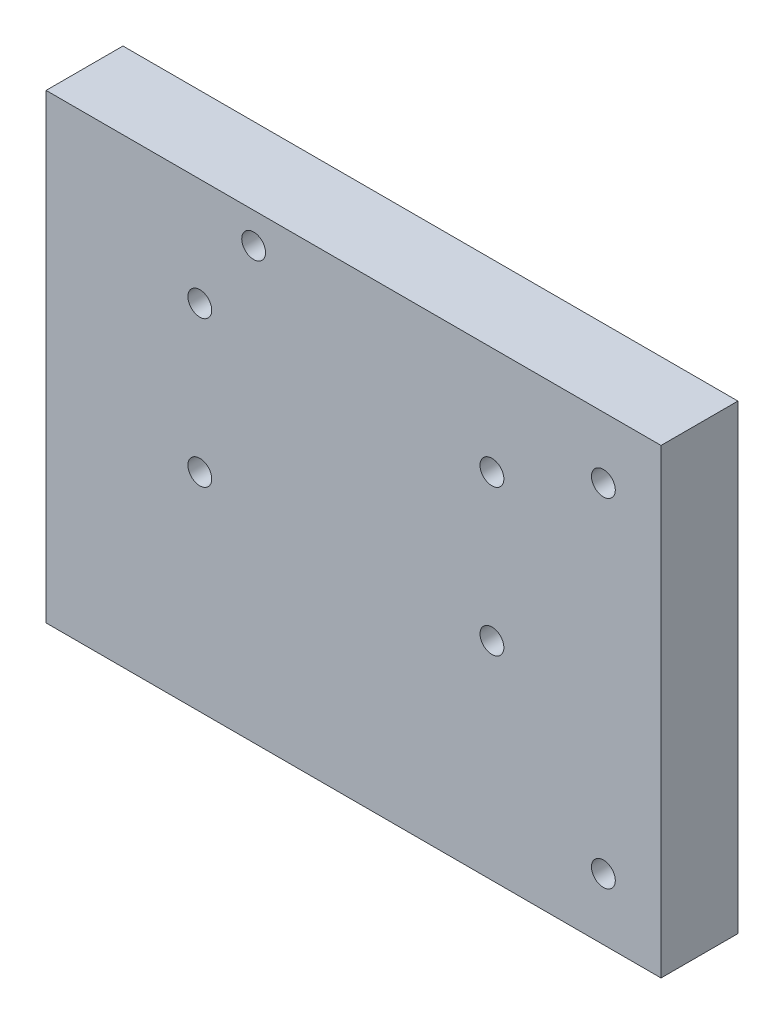
ISO-10303-21;
HEADER;
FILE_DESCRIPTION(('STEP AP214'),'2;1');
FILE_NAME('part.step','',(''),(''),'','','');
FILE_SCHEMA(('AUTOMOTIVE_DESIGN { 1 0 10303 214 1 1 1 1 }'));
ENDSEC;
DATA;
#1=APPLICATION_CONTEXT('core data for automotive mechanical design processes');
#2=APPLICATION_PROTOCOL_DEFINITION('international standard','automotive_design',2000,#1);
#3=PRODUCT_CONTEXT('',#1,'mechanical');
#4=PRODUCT('Part','Part','',(#3));
#5=PRODUCT_RELATED_PRODUCT_CATEGORY('part','',(#4));
#6=PRODUCT_DEFINITION_FORMATION('','',#4);
#7=PRODUCT_DEFINITION_CONTEXT('part definition',#1,'design');
#8=PRODUCT_DEFINITION('design','',#6,#7);
#9=PRODUCT_DEFINITION_SHAPE('','',#8);
#10=(LENGTH_UNIT() NAMED_UNIT(*) SI_UNIT(.MILLI.,.METRE.));
#11=(NAMED_UNIT(*) PLANE_ANGLE_UNIT() SI_UNIT($,.RADIAN.));
#12=(NAMED_UNIT(*) SI_UNIT($,.STERADIAN.) SOLID_ANGLE_UNIT());
#13=UNCERTAINTY_MEASURE_WITH_UNIT(LENGTH_MEASURE(1.E-05),#10,'distance_accuracy_value','');
#14=(GEOMETRIC_REPRESENTATION_CONTEXT(3) GLOBAL_UNCERTAINTY_ASSIGNED_CONTEXT((#13)) GLOBAL_UNIT_ASSIGNED_CONTEXT((#10,
#11,#12)) REPRESENTATION_CONTEXT('',''));
#15=CARTESIAN_POINT('',(0.,0.,0.));
#16=DIRECTION('',(0.,0.,1.));
#17=DIRECTION('',(1.,0.,0.));
#18=AXIS2_PLACEMENT_3D('',#15,#16,#17);
#19=CARTESIAN_POINT('',(0.,0.,10.));
#20=DIRECTION('',(0.,0.,-1.));
#21=DIRECTION('',(-1.,0.,0.));
#22=AXIS2_PLACEMENT_3D('',#19,#20,#21);
#23=PLANE('',#22);
#24=CARTESIAN_POINT('',(32.5,22.,10.));
#25=DIRECTION('',(0.,0.,1.));
#26=DIRECTION('',(1.,0.,0.));
#27=AXIS2_PLACEMENT_3D('',#24,#25,#26);
#28=CIRCLE('',#27,1.55);
#29=CARTESIAN_POINT('',(34.05,22.,10.));
#30=VERTEX_POINT('',#29);
#31=EDGE_CURVE('E145',#30,#30,#28,.T.);
#32=ORIENTED_EDGE('',*,*,#31,.F.);
#33=EDGE_LOOP('',(#32));
#34=FACE_BOUND('',#33,.T.);
#35=CARTESIAN_POINT('',(32.5,-22.,10.));
#36=DIRECTION('',(0.,0.,1.));
#37=DIRECTION('',(1.,0.,0.));
#38=AXIS2_PLACEMENT_3D('',#35,#36,#37);
#39=CIRCLE('',#38,1.54999999999999);
#40=CARTESIAN_POINT('',(34.05,-22.,10.));
#41=VERTEX_POINT('',#40);
#42=EDGE_CURVE('E149',#41,#41,#39,.T.);
#43=ORIENTED_EDGE('',*,*,#42,.F.);
#44=EDGE_LOOP('',(#43));
#45=FACE_BOUND('',#44,.T.);
#46=CARTESIAN_POINT('',(-13.,26.,10.));
#47=DIRECTION('',(0.,0.,-1.));
#48=DIRECTION('',(-1.,0.,0.));
#49=AXIS2_PLACEMENT_3D('',#46,#47,#48);
#50=CIRCLE('',#49,1.55);
#51=CARTESIAN_POINT('',(-14.55,26.,10.));
#52=VERTEX_POINT('',#51);
#53=EDGE_CURVE('E137',#52,#52,#50,.F.);
#54=ORIENTED_EDGE('',*,*,#53,.F.);
#55=EDGE_LOOP('',(#54));
#56=FACE_BOUND('',#55,.T.);
#57=DIRECTION('',(0.,1.,0.));
#58=VECTOR('',#57,1.);
#59=CARTESIAN_POINT('',(40.,-30.,10.));
#60=LINE('',#59,#58);
#61=CARTESIAN_POINT('',(40.,-30.,10.));
#62=VERTEX_POINT('',#61);
#63=CARTESIAN_POINT('',(40.,30.,10.));
#64=VERTEX_POINT('',#63);
#65=EDGE_CURVE('E89',#62,#64,#60,.T.);
#66=ORIENTED_EDGE('',*,*,#65,.T.);
#67=DIRECTION('',(-1.,0.,0.));
#68=VECTOR('',#67,1.);
#69=CARTESIAN_POINT('',(-40.,30.,10.));
#70=LINE('',#69,#68);
#71=CARTESIAN_POINT('',(-40.,30.,10.));
#72=VERTEX_POINT('',#71);
#73=EDGE_CURVE('E84',#64,#72,#70,.T.);
#74=ORIENTED_EDGE('',*,*,#73,.T.);
#75=DIRECTION('',(0.,-1.,0.));
#76=VECTOR('',#75,1.);
#77=CARTESIAN_POINT('',(-40.,-30.,10.));
#78=LINE('',#77,#76);
#79=CARTESIAN_POINT('',(-40.,-30.,10.));
#80=VERTEX_POINT('',#79);
#81=EDGE_CURVE('E87',#72,#80,#78,.T.);
#82=ORIENTED_EDGE('',*,*,#81,.T.);
#83=DIRECTION('',(1.,0.,0.));
#84=VECTOR('',#83,1.);
#85=CARTESIAN_POINT('',(-40.,-30.,10.));
#86=LINE('',#85,#84);
#87=EDGE_CURVE('E54',#80,#62,#86,.T.);
#88=ORIENTED_EDGE('',*,*,#87,.T.);
#89=EDGE_LOOP('',(#66,#74,#82,#88));
#90=FACE_BOUND('',#89,.T.);
#91=CARTESIAN_POINT('',(-20.,16.,10.));
#92=DIRECTION('',(0.,0.,1.));
#93=DIRECTION('',(1.,0.,0.));
#94=AXIS2_PLACEMENT_3D('',#91,#92,#93);
#95=CIRCLE('',#94,1.55);
#96=CARTESIAN_POINT('',(-18.45,16.,10.));
#97=VERTEX_POINT('',#96);
#98=EDGE_CURVE('E104',#97,#97,#95,.T.);
#99=ORIENTED_EDGE('',*,*,#98,.F.);
#100=EDGE_LOOP('',(#99));
#101=FACE_BOUND('',#100,.T.);
#102=CARTESIAN_POINT('',(18.,16.,10.));
#103=DIRECTION('',(0.,0.,1.));
#104=DIRECTION('',(1.,0.,0.));
#105=AXIS2_PLACEMENT_3D('',#102,#103,#104);
#106=CIRCLE('',#105,1.55);
#107=CARTESIAN_POINT('',(19.55,16.,10.));
#108=VERTEX_POINT('',#107);
#109=EDGE_CURVE('E119',#108,#108,#106,.T.);
#110=ORIENTED_EDGE('',*,*,#109,.F.);
#111=EDGE_LOOP('',(#110));
#112=FACE_BOUND('',#111,.T.);
#113=CARTESIAN_POINT('',(18.,-3.,10.));
#114=DIRECTION('',(0.,0.,1.));
#115=DIRECTION('',(1.,0.,0.));
#116=AXIS2_PLACEMENT_3D('',#113,#114,#115);
#117=CIRCLE('',#116,1.55);
#118=CARTESIAN_POINT('',(19.55,-3.,10.));
#119=VERTEX_POINT('',#118);
#120=EDGE_CURVE('E125',#119,#119,#117,.T.);
#121=ORIENTED_EDGE('',*,*,#120,.F.);
#122=EDGE_LOOP('',(#121));
#123=FACE_BOUND('',#122,.T.);
#124=CARTESIAN_POINT('',(-20.,-3.,10.));
#125=DIRECTION('',(0.,0.,1.));
#126=DIRECTION('',(1.,0.,0.));
#127=AXIS2_PLACEMENT_3D('',#124,#125,#126);
#128=CIRCLE('',#127,1.55);
#129=CARTESIAN_POINT('',(-18.45,-3.,10.));
#130=VERTEX_POINT('',#129);
#131=EDGE_CURVE('E131',#130,#130,#128,.T.);
#132=ORIENTED_EDGE('',*,*,#131,.F.);
#133=EDGE_LOOP('',(#132));
#134=FACE_BOUND('',#133,.T.);
#135=ADVANCED_FACE('F37',(#34,#45,#56,#90,#101,#112,#123,#134),#23,.F.);
#136=CARTESIAN_POINT('',(0.,0.,0.));
#137=DIRECTION('',(0.,0.,-1.));
#138=DIRECTION('',(-1.,0.,0.));
#139=AXIS2_PLACEMENT_3D('',#136,#137,#138);
#140=PLANE('',#139);
#141=CARTESIAN_POINT('',(32.5,22.,0.));
#142=DIRECTION('',(0.,0.,-1.));
#143=DIRECTION('',(-1.,0.,0.));
#144=AXIS2_PLACEMENT_3D('',#141,#142,#143);
#145=CIRCLE('',#144,1.55);
#146=CARTESIAN_POINT('',(30.95,22.,0.));
#147=VERTEX_POINT('',#146);
#148=EDGE_CURVE('E152',#147,#147,#145,.F.);
#149=ORIENTED_EDGE('',*,*,#148,.T.);
#150=EDGE_LOOP('',(#149));
#151=FACE_BOUND('',#150,.T.);
#152=CARTESIAN_POINT('',(32.5,-22.,0.));
#153=DIRECTION('',(0.,0.,-1.));
#154=DIRECTION('',(-1.,0.,0.));
#155=AXIS2_PLACEMENT_3D('',#152,#153,#154);
#156=CIRCLE('',#155,1.54999999999999);
#157=CARTESIAN_POINT('',(30.95,-22.,0.));
#158=VERTEX_POINT('',#157);
#159=EDGE_CURVE('E146',#158,#158,#156,.F.);
#160=ORIENTED_EDGE('',*,*,#159,.T.);
#161=EDGE_LOOP('',(#160));
#162=FACE_BOUND('',#161,.T.);
#163=CARTESIAN_POINT('',(-13.,26.,0.));
#164=DIRECTION('',(0.,0.,-1.));
#165=DIRECTION('',(-1.,0.,0.));
#166=AXIS2_PLACEMENT_3D('',#163,#164,#165);
#167=CIRCLE('',#166,1.55);
#168=CARTESIAN_POINT('',(-14.55,26.,0.));
#169=VERTEX_POINT('',#168);
#170=EDGE_CURVE('E142',#169,#169,#167,.T.);
#171=ORIENTED_EDGE('',*,*,#170,.F.);
#172=EDGE_LOOP('',(#171));
#173=FACE_BOUND('',#172,.T.);
#174=CARTESIAN_POINT('',(18.,-3.,0.));
#175=DIRECTION('',(0.,0.,1.));
#176=DIRECTION('',(1.,0.,0.));
#177=AXIS2_PLACEMENT_3D('',#174,#175,#176);
#178=CIRCLE('',#177,1.55);
#179=CARTESIAN_POINT('',(19.55,-3.,0.));
#180=VERTEX_POINT('',#179);
#181=EDGE_CURVE('E128',#180,#180,#178,.T.);
#182=ORIENTED_EDGE('',*,*,#181,.T.);
#183=EDGE_LOOP('',(#182));
#184=FACE_BOUND('',#183,.T.);
#185=CARTESIAN_POINT('',(-20.,16.,0.));
#186=DIRECTION('',(0.,0.,1.));
#187=DIRECTION('',(1.,0.,0.));
#188=AXIS2_PLACEMENT_3D('',#185,#186,#187);
#189=CIRCLE('',#188,1.55);
#190=CARTESIAN_POINT('',(-18.45,16.,0.));
#191=VERTEX_POINT('',#190);
#192=EDGE_CURVE('E116',#191,#191,#189,.T.);
#193=ORIENTED_EDGE('',*,*,#192,.T.);
#194=EDGE_LOOP('',(#193));
#195=FACE_BOUND('',#194,.T.);
#196=DIRECTION('',(0.,1.,0.));
#197=VECTOR('',#196,1.);
#198=CARTESIAN_POINT('',(40.,-30.,0.));
#199=LINE('',#198,#197);
#200=CARTESIAN_POINT('',(40.,-30.,0.));
#201=VERTEX_POINT('',#200);
#202=CARTESIAN_POINT('',(40.,30.,0.));
#203=VERTEX_POINT('',#202);
#204=EDGE_CURVE('E101',#201,#203,#199,.T.);
#205=ORIENTED_EDGE('',*,*,#204,.F.);
#206=DIRECTION('',(1.,0.,0.));
#207=VECTOR('',#206,1.);
#208=CARTESIAN_POINT('',(-40.,-30.,0.));
#209=LINE('',#208,#207);
#210=CARTESIAN_POINT('',(-40.,-30.,0.));
#211=VERTEX_POINT('',#210);
#212=EDGE_CURVE('E77',#211,#201,#209,.T.);
#213=ORIENTED_EDGE('',*,*,#212,.F.);
#214=DIRECTION('',(0.,-1.,0.));
#215=VECTOR('',#214,1.);
#216=CARTESIAN_POINT('',(-40.,-30.,0.));
#217=LINE('',#216,#215);
#218=CARTESIAN_POINT('',(-40.,30.,0.));
#219=VERTEX_POINT('',#218);
#220=EDGE_CURVE('E71',#219,#211,#217,.T.);
#221=ORIENTED_EDGE('',*,*,#220,.F.);
#222=DIRECTION('',(-1.,0.,0.));
#223=VECTOR('',#222,1.);
#224=CARTESIAN_POINT('',(-40.,30.,0.));
#225=LINE('',#224,#223);
#226=EDGE_CURVE('E93',#203,#219,#225,.T.);
#227=ORIENTED_EDGE('',*,*,#226,.F.);
#228=EDGE_LOOP('',(#205,#213,#221,#227));
#229=FACE_BOUND('',#228,.T.);
#230=CARTESIAN_POINT('',(18.,16.,0.));
#231=DIRECTION('',(0.,0.,1.));
#232=DIRECTION('',(1.,0.,0.));
#233=AXIS2_PLACEMENT_3D('',#230,#231,#232);
#234=CIRCLE('',#233,1.55);
#235=CARTESIAN_POINT('',(19.55,16.,0.));
#236=VERTEX_POINT('',#235);
#237=EDGE_CURVE('E122',#236,#236,#234,.T.);
#238=ORIENTED_EDGE('',*,*,#237,.T.);
#239=EDGE_LOOP('',(#238));
#240=FACE_BOUND('',#239,.T.);
#241=CARTESIAN_POINT('',(-20.,-3.,0.));
#242=DIRECTION('',(0.,0.,1.));
#243=DIRECTION('',(1.,0.,0.));
#244=AXIS2_PLACEMENT_3D('',#241,#242,#243);
#245=CIRCLE('',#244,1.55);
#246=CARTESIAN_POINT('',(-18.45,-3.,0.));
#247=VERTEX_POINT('',#246);
#248=EDGE_CURVE('E134',#247,#247,#245,.T.);
#249=ORIENTED_EDGE('',*,*,#248,.T.);
#250=EDGE_LOOP('',(#249));
#251=FACE_BOUND('',#250,.T.);
#252=ADVANCED_FACE('F112',(#151,#162,#173,#184,#195,#229,#240,#251),#140,.T.);
#253=CARTESIAN_POINT('',(40.,-30.,10.));
#254=DIRECTION('',(-1.,0.,0.));
#255=DIRECTION('',(0.,0.,1.));
#256=AXIS2_PLACEMENT_3D('',#253,#254,#255);
#257=PLANE('',#256);
#258=ORIENTED_EDGE('',*,*,#204,.T.);
#259=DIRECTION('',(0.,0.,-1.));
#260=VECTOR('',#259,1.);
#261=CARTESIAN_POINT('',(40.,30.,10.));
#262=LINE('',#261,#260);
#263=EDGE_CURVE('E11',#64,#203,#262,.T.);
#264=ORIENTED_EDGE('',*,*,#263,.F.);
#265=ORIENTED_EDGE('',*,*,#65,.F.);
#266=DIRECTION('',(0.,0.,-1.));
#267=VECTOR('',#266,1.);
#268=CARTESIAN_POINT('',(40.,-30.,10.));
#269=LINE('',#268,#267);
#270=EDGE_CURVE('E97',#62,#201,#269,.T.);
#271=ORIENTED_EDGE('',*,*,#270,.T.);
#272=EDGE_LOOP('',(#258,#264,#265,#271));
#273=FACE_BOUND('',#272,.T.);
#274=ADVANCED_FACE('F39',(#273),#257,.F.);
#275=CARTESIAN_POINT('',(-40.,30.,10.));
#276=DIRECTION('',(0.,-1.,0.));
#277=DIRECTION('',(0.,0.,-1.));
#278=AXIS2_PLACEMENT_3D('',#275,#276,#277);
#279=PLANE('',#278);
#280=ORIENTED_EDGE('',*,*,#226,.T.);
#281=DIRECTION('',(0.,0.,-1.));
#282=VECTOR('',#281,1.);
#283=CARTESIAN_POINT('',(-40.,30.,10.));
#284=LINE('',#283,#282);
#285=EDGE_CURVE('E46',#72,#219,#284,.T.);
#286=ORIENTED_EDGE('',*,*,#285,.F.);
#287=ORIENTED_EDGE('',*,*,#73,.F.);
#288=ORIENTED_EDGE('',*,*,#263,.T.);
#289=EDGE_LOOP('',(#280,#286,#287,#288));
#290=FACE_BOUND('',#289,.T.);
#291=ADVANCED_FACE('F92',(#290),#279,.F.);
#292=CARTESIAN_POINT('',(-40.,-30.,10.));
#293=DIRECTION('',(1.,0.,0.));
#294=DIRECTION('',(0.,0.,-1.));
#295=AXIS2_PLACEMENT_3D('',#292,#293,#294);
#296=PLANE('',#295);
#297=ORIENTED_EDGE('',*,*,#220,.T.);
#298=DIRECTION('',(0.,0.,-1.));
#299=VECTOR('',#298,1.);
#300=CARTESIAN_POINT('',(-40.,-30.,10.));
#301=LINE('',#300,#299);
#302=EDGE_CURVE('E94',#80,#211,#301,.T.);
#303=ORIENTED_EDGE('',*,*,#302,.F.);
#304=ORIENTED_EDGE('',*,*,#81,.F.);
#305=ORIENTED_EDGE('',*,*,#285,.T.);
#306=EDGE_LOOP('',(#297,#303,#304,#305));
#307=FACE_BOUND('',#306,.T.);
#308=ADVANCED_FACE('F95',(#307),#296,.F.);
#309=CARTESIAN_POINT('',(-40.,-30.,10.));
#310=DIRECTION('',(0.,1.,0.));
#311=DIRECTION('',(0.,0.,1.));
#312=AXIS2_PLACEMENT_3D('',#309,#310,#311);
#313=PLANE('',#312);
#314=ORIENTED_EDGE('',*,*,#212,.T.);
#315=ORIENTED_EDGE('',*,*,#270,.F.);
#316=ORIENTED_EDGE('',*,*,#87,.F.);
#317=ORIENTED_EDGE('',*,*,#302,.T.);
#318=EDGE_LOOP('',(#314,#315,#316,#317));
#319=FACE_BOUND('',#318,.T.);
#320=ADVANCED_FACE('F109',(#319),#313,.F.);
#321=CARTESIAN_POINT('',(-20.,16.,10.));
#322=DIRECTION('',(0.,0.,-1.));
#323=DIRECTION('',(-1.,0.,0.));
#324=AXIS2_PLACEMENT_3D('',#321,#322,#323);
#325=CYLINDRICAL_SURFACE('',#324,1.55);
#326=ORIENTED_EDGE('',*,*,#98,.T.);
#327=EDGE_LOOP('',(#326));
#328=FACE_BOUND('',#327,.T.);
#329=ORIENTED_EDGE('',*,*,#192,.F.);
#330=EDGE_LOOP('',(#329));
#331=FACE_BOUND('',#330,.T.);
#332=ADVANCED_FACE('F190',(#328,#331),#325,.F.);
#333=CARTESIAN_POINT('',(18.,16.,10.));
#334=DIRECTION('',(0.,0.,-1.));
#335=DIRECTION('',(-1.,0.,0.));
#336=AXIS2_PLACEMENT_3D('',#333,#334,#335);
#337=CYLINDRICAL_SURFACE('',#336,1.55);
#338=ORIENTED_EDGE('',*,*,#109,.T.);
#339=EDGE_LOOP('',(#338));
#340=FACE_BOUND('',#339,.T.);
#341=ORIENTED_EDGE('',*,*,#237,.F.);
#342=EDGE_LOOP('',(#341));
#343=FACE_BOUND('',#342,.T.);
#344=ADVANCED_FACE('F186',(#340,#343),#337,.F.);
#345=CARTESIAN_POINT('',(18.,-3.,10.));
#346=DIRECTION('',(0.,0.,-1.));
#347=DIRECTION('',(-1.,0.,0.));
#348=AXIS2_PLACEMENT_3D('',#345,#346,#347);
#349=CYLINDRICAL_SURFACE('',#348,1.55);
#350=ORIENTED_EDGE('',*,*,#120,.T.);
#351=EDGE_LOOP('',(#350));
#352=FACE_BOUND('',#351,.T.);
#353=ORIENTED_EDGE('',*,*,#181,.F.);
#354=EDGE_LOOP('',(#353));
#355=FACE_BOUND('',#354,.T.);
#356=ADVANCED_FACE('F179',(#352,#355),#349,.F.);
#357=CARTESIAN_POINT('',(-20.,-3.,10.));
#358=DIRECTION('',(0.,0.,-1.));
#359=DIRECTION('',(-1.,0.,0.));
#360=AXIS2_PLACEMENT_3D('',#357,#358,#359);
#361=CYLINDRICAL_SURFACE('',#360,1.55);
#362=ORIENTED_EDGE('',*,*,#131,.T.);
#363=EDGE_LOOP('',(#362));
#364=FACE_BOUND('',#363,.T.);
#365=ORIENTED_EDGE('',*,*,#248,.F.);
#366=EDGE_LOOP('',(#365));
#367=FACE_BOUND('',#366,.T.);
#368=ADVANCED_FACE('F170',(#364,#367),#361,.F.);
#369=CARTESIAN_POINT('',(-13.,26.,10.001));
#370=DIRECTION('',(0.,0.,-1.));
#371=DIRECTION('',(-1.,0.,0.));
#372=AXIS2_PLACEMENT_3D('',#369,#370,#371);
#373=CYLINDRICAL_SURFACE('',#372,1.55);
#374=ORIENTED_EDGE('',*,*,#170,.T.);
#375=EDGE_LOOP('',(#374));
#376=FACE_BOUND('',#375,.T.);
#377=ORIENTED_EDGE('',*,*,#53,.T.);
#378=EDGE_LOOP('',(#377));
#379=FACE_BOUND('',#378,.T.);
#380=ADVANCED_FACE('F167',(#376,#379),#373,.F.);
#381=CARTESIAN_POINT('',(32.5,-22.,-0.000999999999999265));
#382=DIRECTION('',(0.,0.,1.));
#383=DIRECTION('',(1.,0.,0.));
#384=AXIS2_PLACEMENT_3D('',#381,#382,#383);
#385=CYLINDRICAL_SURFACE('',#384,1.54999999999999);
#386=ORIENTED_EDGE('',*,*,#159,.F.);
#387=EDGE_LOOP('',(#386));
#388=FACE_BOUND('',#387,.T.);
#389=ORIENTED_EDGE('',*,*,#42,.T.);
#390=EDGE_LOOP('',(#389));
#391=FACE_BOUND('',#390,.T.);
#392=ADVANCED_FACE('F169',(#388,#391),#385,.F.);
#393=CARTESIAN_POINT('',(32.5,22.,-0.000999999999999265));
#394=DIRECTION('',(0.,0.,1.));
#395=DIRECTION('',(1.,0.,0.));
#396=AXIS2_PLACEMENT_3D('',#393,#394,#395);
#397=CYLINDRICAL_SURFACE('',#396,1.55);
#398=ORIENTED_EDGE('',*,*,#148,.F.);
#399=EDGE_LOOP('',(#398));
#400=FACE_BOUND('',#399,.T.);
#401=ORIENTED_EDGE('',*,*,#31,.T.);
#402=EDGE_LOOP('',(#401));
#403=FACE_BOUND('',#402,.T.);
#404=ADVANCED_FACE('F158',(#400,#403),#397,.F.);
#405=CLOSED_SHELL('',(#135,#252,#274,#291,#308,#320,#332,#344,#356,#368,#380,#392,#404));
#406=MANIFOLD_SOLID_BREP('B2',#405);
#407=ADVANCED_BREP_SHAPE_REPRESENTATION('',(#18,#406),#14);
#408=SHAPE_DEFINITION_REPRESENTATION(#9,#407);
ENDSEC;
END-ISO-10303-21;
